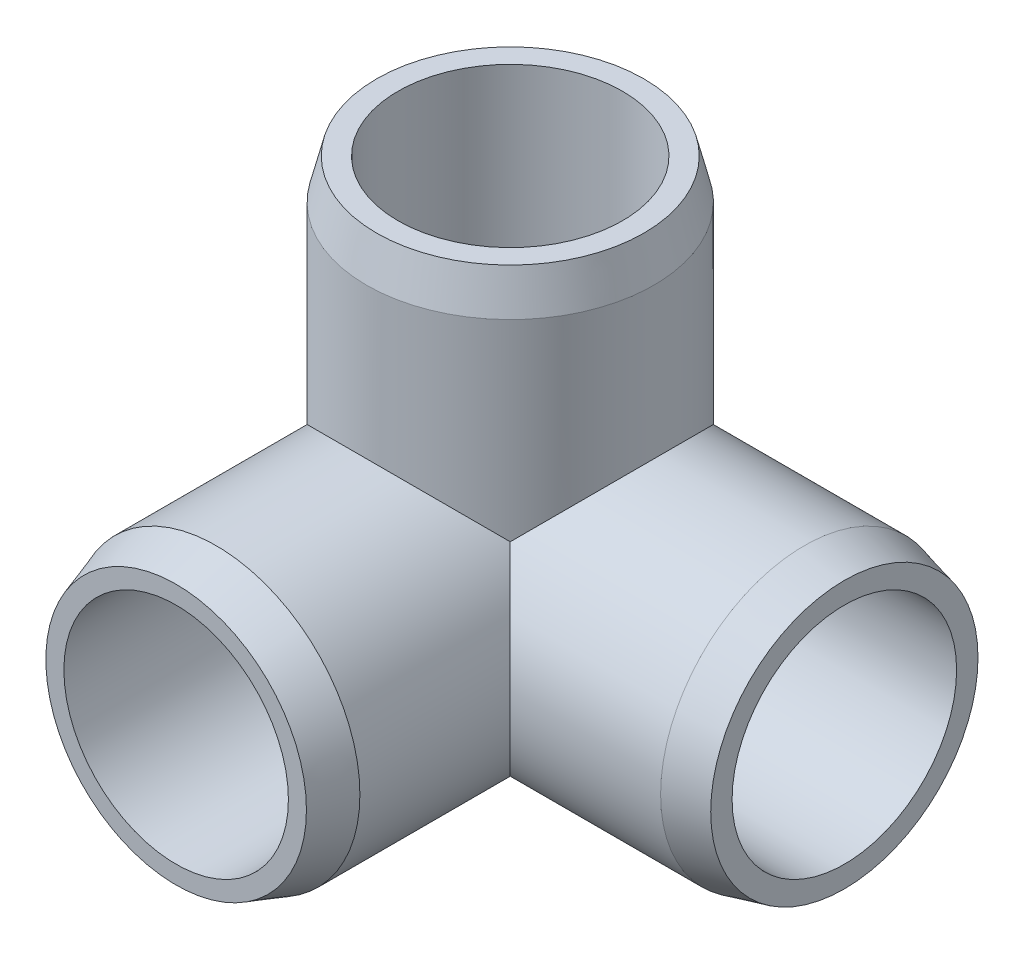
ISO-10303-21;
HEADER;
FILE_DESCRIPTION(('STEP AP214'),'2;1');
FILE_NAME('part.step','',(''),(''),'','','');
FILE_SCHEMA(('AUTOMOTIVE_DESIGN { 1 0 10303 214 1 1 1 1 }'));
ENDSEC;
DATA;
#1=APPLICATION_CONTEXT('core data for automotive mechanical design processes');
#2=APPLICATION_PROTOCOL_DEFINITION('international standard','automotive_design',2000,#1);
#3=PRODUCT_CONTEXT('',#1,'mechanical');
#4=PRODUCT('Part','Part','',(#3));
#5=PRODUCT_RELATED_PRODUCT_CATEGORY('part','',(#4));
#6=PRODUCT_DEFINITION_FORMATION('','',#4);
#7=PRODUCT_DEFINITION_CONTEXT('part definition',#1,'design');
#8=PRODUCT_DEFINITION('design','',#6,#7);
#9=PRODUCT_DEFINITION_SHAPE('','',#8);
#10=(LENGTH_UNIT() NAMED_UNIT(*) SI_UNIT(.MILLI.,.METRE.));
#11=(NAMED_UNIT(*) PLANE_ANGLE_UNIT() SI_UNIT($,.RADIAN.));
#12=(NAMED_UNIT(*) SI_UNIT($,.STERADIAN.) SOLID_ANGLE_UNIT());
#13=UNCERTAINTY_MEASURE_WITH_UNIT(LENGTH_MEASURE(1.E-05),#10,'distance_accuracy_value','');
#14=(GEOMETRIC_REPRESENTATION_CONTEXT(3) GLOBAL_UNCERTAINTY_ASSIGNED_CONTEXT((#13)) GLOBAL_UNIT_ASSIGNED_CONTEXT((#10,
#11,#12)) REPRESENTATION_CONTEXT('',''));
#15=CARTESIAN_POINT('',(0.,0.,0.));
#16=DIRECTION('',(0.,0.,1.));
#17=DIRECTION('',(1.,0.,0.));
#18=AXIS2_PLACEMENT_3D('',#15,#16,#17);
#19=CARTESIAN_POINT('',(31.75,13.6525,0.));
#20=DIRECTION('',(1.,0.,0.));
#21=DIRECTION('',(0.,0.,-1.));
#22=AXIS2_PLACEMENT_3D('',#19,#20,#21);
#23=PLANE('',#22);
#24=CARTESIAN_POINT('',(31.75,13.6525,0.));
#25=DIRECTION('',(1.,0.,0.));
#26=DIRECTION('',(0.,0.,-1.));
#27=AXIS2_PLACEMENT_3D('',#24,#25,#26);
#28=CIRCLE('',#27,10.6679999999998);
#29=CARTESIAN_POINT('',(31.75,13.6525,-10.6679999999999));
#30=VERTEX_POINT('',#29);
#31=EDGE_CURVE('E116',#30,#30,#28,.T.);
#32=ORIENTED_EDGE('',*,*,#31,.F.);
#33=EDGE_LOOP('',(#32));
#34=FACE_BOUND('',#33,.T.);
#35=CARTESIAN_POINT('',(31.75,13.6525,0.));
#36=DIRECTION('',(1.,0.,0.));
#37=DIRECTION('',(0.,0.,-1.));
#38=AXIS2_PLACEMENT_3D('',#35,#36,#37);
#39=CIRCLE('',#38,12.6999999999998);
#40=CARTESIAN_POINT('',(31.75,13.6525,-12.6999999999998));
#41=VERTEX_POINT('',#40);
#42=EDGE_CURVE('E227',#41,#41,#39,.T.);
#43=ORIENTED_EDGE('',*,*,#42,.T.);
#44=EDGE_LOOP('',(#43));
#45=FACE_BOUND('',#44,.T.);
#46=ADVANCED_FACE('F39',(#34,#45),#23,.T.);
#47=CARTESIAN_POINT('',(-500000.,13.6525,0.));
#48=DIRECTION('',(1.,0.,0.));
#49=DIRECTION('',(0.,0.,-1.));
#50=AXIS2_PLACEMENT_3D('',#47,#48,#49);
#51=CYLINDRICAL_SURFACE('',#50,13.6524999999998);
#52=CARTESIAN_POINT('',(0.,13.6525,0.));
#53=DIRECTION('',(1.,0.,0.));
#54=DIRECTION('',(0.,0.,-1.));
#55=AXIS2_PLACEMENT_3D('',#52,#53,#54);
#56=CIRCLE('',#55,13.6525);
#57=CARTESIAN_POINT('',(0.,13.6525,-13.6525));
#58=VERTEX_POINT('',#57);
#59=CARTESIAN_POINT('',(0.,0.,0.));
#60=VERTEX_POINT('',#59);
#61=EDGE_CURVE('E107',#58,#60,#56,.F.);
#62=ORIENTED_EDGE('',*,*,#61,.F.);
#63=CARTESIAN_POINT('',(0.,13.6525,0.));
#64=DIRECTION('',(0.707106781186547,-0.707106781186547,0.));
#65=DIRECTION('',(0.707106781186547,0.707106781186547,0.));
#66=AXIS2_PLACEMENT_3D('',#63,#64,#65);
#67=ELLIPSE('',#66,19.3075506602986,13.6524999999999);
#68=CARTESIAN_POINT('',(9.65377533014933,23.3062753301493,9.65377533014926));
#69=VERTEX_POINT('',#68);
#70=EDGE_CURVE('E109',#58,#69,#67,.T.);
#71=ORIENTED_EDGE('',*,*,#70,.T.);
#72=CARTESIAN_POINT('',(5.6843418860808E-11,13.6525,0.));
#73=DIRECTION('',(0.707106781186545,0.,-0.70710678118655));
#74=DIRECTION('',(0.70710678118655,0.,0.707106781186545));
#75=AXIS2_PLACEMENT_3D('',#72,#73,#74);
#76=ELLIPSE('',#75,19.3075506602986,13.6524999999999);
#77=EDGE_CURVE('E62',#69,#60,#76,.T.);
#78=ORIENTED_EDGE('',*,*,#77,.T.);
#79=EDGE_LOOP('',(#62,#71,#78));
#80=FACE_BOUND('',#79,.T.);
#81=CARTESIAN_POINT('',(27.94,13.6525,0.));
#82=DIRECTION('',(1.,0.,0.));
#83=DIRECTION('',(0.,0.,-1.));
#84=AXIS2_PLACEMENT_3D('',#81,#82,#83);
#85=CIRCLE('',#84,13.6524999999998);
#86=CARTESIAN_POINT('',(27.94,13.6525,-13.6524999999998));
#87=VERTEX_POINT('',#86);
#88=EDGE_CURVE('E224',#87,#87,#85,.T.);
#89=ORIENTED_EDGE('',*,*,#88,.F.);
#90=EDGE_LOOP('',(#89));
#91=FACE_BOUND('',#90,.T.);
#92=ADVANCED_FACE('F189',(#80,#91),#51,.T.);
#93=CARTESIAN_POINT('',(-500000.,13.6525,0.));
#94=DIRECTION('',(1.,0.,0.));
#95=DIRECTION('',(0.,0.,-1.));
#96=AXIS2_PLACEMENT_3D('',#93,#94,#95);
#97=CYLINDRICAL_SURFACE('',#96,10.6679999999998);
#98=ORIENTED_EDGE('',*,*,#31,.T.);
#99=EDGE_LOOP('',(#98));
#100=FACE_BOUND('',#99,.T.);
#101=CARTESIAN_POINT('',(12.6999999999953,13.6525,0.));
#102=DIRECTION('',(-1.,0.,0.));
#103=DIRECTION('',(0.,0.,1.));
#104=AXIS2_PLACEMENT_3D('',#101,#102,#103);
#105=CIRCLE('',#104,10.6679999999998);
#106=CARTESIAN_POINT('',(12.6999999999953,13.6525,10.6679999999997));
#107=VERTEX_POINT('',#106);
#108=EDGE_CURVE('E12',#107,#107,#105,.F.);
#109=ORIENTED_EDGE('',*,*,#108,.F.);
#110=EDGE_LOOP('',(#109));
#111=FACE_BOUND('',#110,.T.);
#112=ADVANCED_FACE('F181',(#100,#111),#97,.F.);
#113=CARTESIAN_POINT('',(0.25399999999999,13.6525,0.));
#114=DIRECTION('',(1.,0.,0.));
#115=DIRECTION('',(0.,0.,-1.));
#116=AXIS2_PLACEMENT_3D('',#113,#114,#115);
#117=CIRCLE('',#116,10.6679999999998);
#118=CARTESIAN_POINT('',(0.253999999999992,2.98752423818976,0.253999999992599));
#119=VERTEX_POINT('',#118);
#120=CARTESIAN_POINT('',(0.25399999999999,13.9064999999964,-10.6649757618102));
#121=VERTEX_POINT('',#120);
#122=EDGE_CURVE('E91',#119,#121,#117,.T.);
#123=ORIENTED_EDGE('',*,*,#122,.F.);
#124=CARTESIAN_POINT('',(0.,13.6525,0.));
#125=DIRECTION('',(-0.707106781186545,0.,0.70710678118655));
#126=DIRECTION('',(0.70710678118655,0.,0.707106781186545));
#127=AXIS2_PLACEMENT_3D('',#124,#125,#126);
#128=ELLIPSE('',#127,15.0868302833961,10.6679999999999);
#129=CARTESIAN_POINT('',(7.54341514169815,21.195915141698,7.543415141698));
#130=VERTEX_POINT('',#129);
#131=EDGE_CURVE('E93',#119,#130,#128,.T.);
#132=ORIENTED_EDGE('',*,*,#131,.T.);
#133=CARTESIAN_POINT('',(0.,13.6525,0.));
#134=DIRECTION('',(-0.707106781186547,0.707106781186547,0.));
#135=DIRECTION('',(0.707106781186547,0.707106781186547,0.));
#136=AXIS2_PLACEMENT_3D('',#133,#134,#135);
#137=ELLIPSE('',#136,15.0868302833961,10.6679999999999);
#138=EDGE_CURVE('E87',#121,#130,#137,.F.);
#139=ORIENTED_EDGE('',*,*,#138,.F.);
#140=EDGE_LOOP('',(#123,#132,#139));
#141=FACE_BOUND('',#140,.T.);
#142=CARTESIAN_POINT('',(10.7949999999732,13.6525,0.));
#143=DIRECTION('',(1.,0.,0.));
#144=DIRECTION('',(0.,0.,-1.));
#145=AXIS2_PLACEMENT_3D('',#142,#143,#144);
#146=CIRCLE('',#145,10.6679999999998);
#147=CARTESIAN_POINT('',(10.7949999999732,13.6525,-10.6679999999999));
#148=VERTEX_POINT('',#147);
#149=EDGE_CURVE('E47',#148,#148,#146,.F.);
#150=ORIENTED_EDGE('',*,*,#149,.F.);
#151=EDGE_LOOP('',(#150));
#152=FACE_BOUND('',#151,.T.);
#153=ADVANCED_FACE('F89',(#141,#152),#97,.F.);
#154=CARTESIAN_POINT('',(0.,13.6525,0.));
#155=DIRECTION('',(0.,1.,0.));
#156=DIRECTION('',(1.,0.,0.));
#157=AXIS2_PLACEMENT_3D('',#154,#155,#156);
#158=SPHERICAL_SURFACE('',#157,10.668);
#159=CARTESIAN_POINT('',(0.25399999999999,13.6525,0.));
#160=DIRECTION('',(1.,0.,0.));
#161=DIRECTION('',(0.,0.,-1.));
#162=AXIS2_PLACEMENT_3D('',#159,#160,#161);
#163=CIRCLE('',#162,10.6649757618102);
#164=CARTESIAN_POINT('',(0.25399999999999,13.6525,-10.6649757618102));
#165=VERTEX_POINT('',#164);
#166=CARTESIAN_POINT('',(0.254000000000123,2.98752423818976,0.));
#167=VERTEX_POINT('',#166);
#168=EDGE_CURVE('E54',#165,#167,#163,.F.);
#169=ORIENTED_EDGE('',*,*,#168,.F.);
#170=CARTESIAN_POINT('',(0.,13.6525,0.));
#171=DIRECTION('',(0.,1.,0.));
#172=DIRECTION('',(0.,0.,1.));
#173=AXIS2_PLACEMENT_3D('',#170,#171,#172);
#174=CIRCLE('',#173,10.668);
#175=CARTESIAN_POINT('',(-10.668,13.6525,0.));
#176=VERTEX_POINT('',#175);
#177=EDGE_CURVE('E106',#165,#176,#174,.T.);
#178=ORIENTED_EDGE('',*,*,#177,.T.);
#179=CARTESIAN_POINT('',(0.,13.6525,0.));
#180=DIRECTION('',(0.,0.,1.));
#181=DIRECTION('',(1.,0.,0.));
#182=AXIS2_PLACEMENT_3D('',#179,#180,#181);
#183=CIRCLE('',#182,10.668);
#184=EDGE_CURVE('E149',#176,#167,#183,.T.);
#185=ORIENTED_EDGE('',*,*,#184,.T.);
#186=EDGE_LOOP('',(#169,#178,#185));
#187=FACE_BOUND('',#186,.T.);
#188=ADVANCED_FACE('F180',(#187),#158,.F.);
#189=CARTESIAN_POINT('',(0.,13.6525,0.));
#190=DIRECTION('',(0.,1.,0.));
#191=DIRECTION('',(1.,0.,0.));
#192=AXIS2_PLACEMENT_3D('',#189,#190,#191);
#193=SPHERICAL_SURFACE('',#192,13.6525);
#194=ORIENTED_EDGE('',*,*,#61,.T.);
#195=CARTESIAN_POINT('',(0.,13.6525,0.));
#196=DIRECTION('',(0.,0.,1.));
#197=DIRECTION('',(1.,0.,0.));
#198=AXIS2_PLACEMENT_3D('',#195,#196,#197);
#199=CIRCLE('',#198,13.6525);
#200=CARTESIAN_POINT('',(-13.6525,13.6525,0.));
#201=VERTEX_POINT('',#200);
#202=EDGE_CURVE('E157',#201,#60,#199,.T.);
#203=ORIENTED_EDGE('',*,*,#202,.F.);
#204=CARTESIAN_POINT('',(0.,13.6525,0.));
#205=DIRECTION('',(0.,1.,0.));
#206=DIRECTION('',(0.,0.,1.));
#207=AXIS2_PLACEMENT_3D('',#204,#205,#206);
#208=CIRCLE('',#207,13.6525);
#209=EDGE_CURVE('E165',#58,#201,#208,.T.);
#210=ORIENTED_EDGE('',*,*,#209,.F.);
#211=EDGE_LOOP('',(#194,#203,#210));
#212=FACE_BOUND('',#211,.T.);
#213=ADVANCED_FACE('F41',(#212),#193,.T.);
#214=CARTESIAN_POINT('',(0.,13.6525,-13.6535000000001));
#215=DIRECTION('',(0.,0.,1.));
#216=DIRECTION('',(1.,0.,0.));
#217=AXIS2_PLACEMENT_3D('',#214,#215,#216);
#218=CYLINDRICAL_SURFACE('',#217,13.6525);
#219=ORIENTED_EDGE('',*,*,#202,.T.);
#220=ORIENTED_EDGE('',*,*,#77,.F.);
#221=CARTESIAN_POINT('',(0.,13.6525,0.));
#222=DIRECTION('',(0.,0.707106781186548,-0.707106781186547));
#223=DIRECTION('',(0.,0.707106781186548,0.707106781186547));
#224=AXIS2_PLACEMENT_3D('',#221,#222,#223);
#225=ELLIPSE('',#224,19.3075506602987,13.6525);
#226=EDGE_CURVE('E159',#69,#201,#225,.F.);
#227=ORIENTED_EDGE('',*,*,#226,.T.);
#228=EDGE_LOOP('',(#219,#220,#227));
#229=FACE_BOUND('',#228,.T.);
#230=CARTESIAN_POINT('',(1.56818475708975E-13,13.6525,27.9399999999999));
#231=DIRECTION('',(0.,0.,1.));
#232=DIRECTION('',(1.,0.,0.));
#233=AXIS2_PLACEMENT_3D('',#230,#231,#232);
#234=CIRCLE('',#233,13.6525000000002);
#235=CARTESIAN_POINT('',(13.6525000000003,13.6525,27.9399999999996));
#236=VERTEX_POINT('',#235);
#237=EDGE_CURVE('E118',#236,#236,#234,.T.);
#238=ORIENTED_EDGE('',*,*,#237,.F.);
#239=EDGE_LOOP('',(#238));
#240=FACE_BOUND('',#239,.T.);
#241=ADVANCED_FACE('F377',(#229,#240),#218,.T.);
#242=CARTESIAN_POINT('',(2.21709065016539E-13,13.6525,31.75));
#243=DIRECTION('',(0.,0.,-1.));
#244=DIRECTION('',(-1.,0.,0.));
#245=AXIS2_PLACEMENT_3D('',#242,#243,#244);
#246=PLANE('',#245);
#247=CARTESIAN_POINT('',(2.21709065016539E-13,13.6525,31.75));
#248=DIRECTION('',(0.,0.,-1.));
#249=DIRECTION('',(-1.,0.,0.));
#250=AXIS2_PLACEMENT_3D('',#247,#248,#249);
#251=CIRCLE('',#250,10.668);
#252=CARTESIAN_POINT('',(10.6680000000002,13.6525,31.7499999999999));
#253=VERTEX_POINT('',#252);
#254=EDGE_CURVE('E154',#253,#253,#251,.T.);
#255=ORIENTED_EDGE('',*,*,#254,.T.);
#256=EDGE_LOOP('',(#255));
#257=FACE_BOUND('',#256,.T.);
#258=CARTESIAN_POINT('',(2.22044604925029E-13,13.6525,31.7499999999999));
#259=DIRECTION('',(0.,0.,1.));
#260=DIRECTION('',(1.,0.,0.));
#261=AXIS2_PLACEMENT_3D('',#258,#259,#260);
#262=CIRCLE('',#261,12.3825);
#263=CARTESIAN_POINT('',(12.3825000000002,13.6525,31.7499999999997));
#264=VERTEX_POINT('',#263);
#265=EDGE_CURVE('E122',#264,#264,#262,.T.);
#266=ORIENTED_EDGE('',*,*,#265,.T.);
#267=EDGE_LOOP('',(#266));
#268=FACE_BOUND('',#267,.T.);
#269=ADVANCED_FACE('F370',(#257,#268),#246,.F.);
#270=CARTESIAN_POINT('',(0.,50.4548533329512,0.));
#271=DIRECTION('',(0.,1.,0.));
#272=DIRECTION('',(0.,0.,1.));
#273=AXIS2_PLACEMENT_3D('',#270,#271,#272);
#274=CYLINDRICAL_SURFACE('',#273,13.6525);
#275=ORIENTED_EDGE('',*,*,#226,.F.);
#276=ORIENTED_EDGE('',*,*,#70,.F.);
#277=ORIENTED_EDGE('',*,*,#209,.T.);
#278=EDGE_LOOP('',(#275,#276,#277));
#279=FACE_BOUND('',#278,.T.);
#280=CARTESIAN_POINT('',(0.,41.5925,0.));
#281=DIRECTION('',(0.,1.,0.));
#282=DIRECTION('',(0.,0.,1.));
#283=AXIS2_PLACEMENT_3D('',#280,#281,#282);
#284=CIRCLE('',#283,13.6525);
#285=CARTESIAN_POINT('',(0.,41.5925,13.6525));
#286=VERTEX_POINT('',#285);
#287=EDGE_CURVE('E125',#286,#286,#284,.T.);
#288=ORIENTED_EDGE('',*,*,#287,.F.);
#289=EDGE_LOOP('',(#288));
#290=FACE_BOUND('',#289,.T.);
#291=ADVANCED_FACE('F362',(#279,#290),#274,.T.);
#292=CARTESIAN_POINT('',(13.6525,45.4025,0.));
#293=DIRECTION('',(0.,-1.,0.));
#294=DIRECTION('',(0.,0.,-1.));
#295=AXIS2_PLACEMENT_3D('',#292,#293,#294);
#296=PLANE('',#295);
#297=CARTESIAN_POINT('',(0.,45.4025,0.));
#298=DIRECTION('',(0.,1.,0.));
#299=DIRECTION('',(0.,0.,1.));
#300=AXIS2_PLACEMENT_3D('',#297,#298,#299);
#301=CIRCLE('',#300,10.668);
#302=CARTESIAN_POINT('',(0.,45.4025,10.668));
#303=VERTEX_POINT('',#302);
#304=EDGE_CURVE('E162',#303,#303,#301,.T.);
#305=ORIENTED_EDGE('',*,*,#304,.F.);
#306=EDGE_LOOP('',(#305));
#307=FACE_BOUND('',#306,.T.);
#308=CARTESIAN_POINT('',(0.,45.4025,0.));
#309=DIRECTION('',(0.,1.,0.));
#310=DIRECTION('',(0.,0.,1.));
#311=AXIS2_PLACEMENT_3D('',#308,#309,#310);
#312=CIRCLE('',#311,12.7);
#313=CARTESIAN_POINT('',(0.,45.4025,12.7));
#314=VERTEX_POINT('',#313);
#315=EDGE_CURVE('E128',#314,#314,#312,.T.);
#316=ORIENTED_EDGE('',*,*,#315,.T.);
#317=EDGE_LOOP('',(#316));
#318=FACE_BOUND('',#317,.T.);
#319=ADVANCED_FACE('F356',(#307,#318),#296,.F.);
#320=CARTESIAN_POINT('',(0.,13.6525,-13.6535000000001));
#321=DIRECTION('',(0.,0.,1.));
#322=DIRECTION('',(1.,0.,0.));
#323=AXIS2_PLACEMENT_3D('',#320,#321,#322);
#324=CYLINDRICAL_SURFACE('',#323,10.668);
#325=CARTESIAN_POINT('',(0.,13.6525,12.7));
#326=DIRECTION('',(0.,0.,1.));
#327=DIRECTION('',(1.,0.,0.));
#328=AXIS2_PLACEMENT_3D('',#325,#326,#327);
#329=CIRCLE('',#328,10.668);
#330=CARTESIAN_POINT('',(10.6680000000001,13.6525,12.7));
#331=VERTEX_POINT('',#330);
#332=EDGE_CURVE('E171',#331,#331,#329,.T.);
#333=CARTESIAN_POINT('',(10.6680000000001,13.6525,12.7));
#334=CARTESIAN_POINT('',(10.6680000000001,13.6525,12.8984375));
#335=CARTESIAN_POINT('',(10.6680000000001,13.6525,13.096875));
#336=CARTESIAN_POINT('',(10.6680000000001,13.6525,13.49375));
#337=CARTESIAN_POINT('',(10.6680000000001,13.6525,13.6921875));
#338=CARTESIAN_POINT('',(10.6680000000001,13.6525,14.0890625));
#339=CARTESIAN_POINT('',(10.6680000000001,13.6525,14.2875));
#340=CARTESIAN_POINT('',(10.6680000000001,13.6525,14.684375));
#341=CARTESIAN_POINT('',(10.6680000000001,13.6525,14.8828125));
#342=CARTESIAN_POINT('',(10.6680000000001,13.6525,15.2796875));
#343=CARTESIAN_POINT('',(10.6680000000001,13.6525,15.478125));
#344=CARTESIAN_POINT('',(10.6680000000001,13.6525,15.875));
#345=CARTESIAN_POINT('',(10.6680000000001,13.6525,16.0734375));
#346=CARTESIAN_POINT('',(10.6680000000001,13.6525,16.4703125));
#347=CARTESIAN_POINT('',(10.6680000000001,13.6525,16.66875));
#348=CARTESIAN_POINT('',(10.6680000000001,13.6525,17.065625));
#349=CARTESIAN_POINT('',(10.6680000000001,13.6525,17.2640625));
#350=CARTESIAN_POINT('',(10.6680000000001,13.6525,17.6609375));
#351=CARTESIAN_POINT('',(10.6680000000001,13.6525,17.859375));
#352=CARTESIAN_POINT('',(10.6680000000001,13.6525,18.25625));
#353=CARTESIAN_POINT('',(10.6680000000001,13.6525,18.4546875));
#354=CARTESIAN_POINT('',(10.6680000000001,13.6525,18.8515625));
#355=CARTESIAN_POINT('',(10.6680000000001,13.6525,19.05));
#356=CARTESIAN_POINT('',(10.6680000000001,13.6525,19.446875));
#357=CARTESIAN_POINT('',(10.6680000000001,13.6525,19.6453125));
#358=CARTESIAN_POINT('',(10.6680000000001,13.6525,20.0421875));
#359=CARTESIAN_POINT('',(10.6680000000001,13.6525,20.240625));
#360=CARTESIAN_POINT('',(10.6680000000001,13.6525,20.6375));
#361=CARTESIAN_POINT('',(10.6680000000001,13.6525,20.8359375));
#362=CARTESIAN_POINT('',(10.6680000000001,13.6525,21.2328125));
#363=CARTESIAN_POINT('',(10.6680000000001,13.6525,21.43125));
#364=CARTESIAN_POINT('',(10.6680000000002,13.6525,21.828125));
#365=CARTESIAN_POINT('',(10.6680000000002,13.6525,22.0265625));
#366=CARTESIAN_POINT('',(10.6680000000002,13.6525,22.4234375));
#367=CARTESIAN_POINT('',(10.6680000000002,13.6525,22.621875));
#368=CARTESIAN_POINT('',(10.6680000000002,13.6525,23.01875));
#369=CARTESIAN_POINT('',(10.6680000000002,13.6525,23.2171875));
#370=CARTESIAN_POINT('',(10.6680000000002,13.6525,23.6140625));
#371=CARTESIAN_POINT('',(10.6680000000002,13.6525,23.8125));
#372=CARTESIAN_POINT('',(10.6680000000002,13.6525,24.209375));
#373=CARTESIAN_POINT('',(10.6680000000002,13.6525,24.4078125));
#374=CARTESIAN_POINT('',(10.6680000000002,13.6525,24.8046875));
#375=CARTESIAN_POINT('',(10.6680000000002,13.6525,25.003125));
#376=CARTESIAN_POINT('',(10.6680000000002,13.6525,25.4));
#377=CARTESIAN_POINT('',(10.6680000000002,13.6525,25.5984375));
#378=CARTESIAN_POINT('',(10.6680000000002,13.6525,25.9953125));
#379=CARTESIAN_POINT('',(10.6680000000002,13.6525,26.1937499999999));
#380=CARTESIAN_POINT('',(10.6680000000002,13.6525,26.5906249999999));
#381=CARTESIAN_POINT('',(10.6680000000002,13.6525,26.7890625));
#382=CARTESIAN_POINT('',(10.6680000000002,13.6525,27.1859374999999));
#383=CARTESIAN_POINT('',(10.6680000000002,13.6525,27.3843749999999));
#384=CARTESIAN_POINT('',(10.6680000000002,13.6525,27.7812499999999));
#385=CARTESIAN_POINT('',(10.6680000000002,13.6525,27.9796874999999));
#386=CARTESIAN_POINT('',(10.6680000000002,13.6525,28.3765624999999));
#387=CARTESIAN_POINT('',(10.6680000000002,13.6525,28.5749999999999));
#388=CARTESIAN_POINT('',(10.6680000000002,13.6525,28.9718749999999));
#389=CARTESIAN_POINT('',(10.6680000000002,13.6525,29.1703124999999));
#390=CARTESIAN_POINT('',(10.6680000000002,13.6525,29.5671874999999));
#391=CARTESIAN_POINT('',(10.6680000000002,13.6525,29.7656249999999));
#392=CARTESIAN_POINT('',(10.6680000000002,13.6525,30.1624999999999));
#393=CARTESIAN_POINT('',(10.6680000000002,13.6525,30.3609374999999));
#394=CARTESIAN_POINT('',(10.6680000000002,13.6525,30.7578124999999));
#395=CARTESIAN_POINT('',(10.6680000000002,13.6525,30.9562499999999));
#396=CARTESIAN_POINT('',(10.6680000000002,13.6525,31.3531249999999));
#397=CARTESIAN_POINT('',(10.6680000000002,13.6525,31.5515624999999));
#398=CARTESIAN_POINT('',(10.6680000000002,13.6525,31.7499999999999));
#399=B_SPLINE_CURVE_WITH_KNOTS('',3,(#333,#334,#335,#336,#337,#338,#339,#340,#341,#342,#343,
#344,#345,#346,#347,#348,#349,#350,#351,#352,#353,#354,#355,#356,#357,#358,#359,#360,#361,#362,
#363,#364,#365,#366,#367,#368,#369,#370,#371,#372,#373,#374,#375,#376,#377,#378,#379,#380,#381,
#382,#383,#384,#385,#386,#387,#388,#389,#390,#391,#392,#393,#394,#395,#396,#397,#398),
.UNSPECIFIED.,.F.,.F.,(4,2,2,2,2,2,2,2,2,2,2,2,2,2,2,2,2,2,2,2,2,2,2,2,2,2,2,2,2,2,2,2,4),(0.,
0.595312499999997,1.190625,1.78593749999999,2.38124999999999,2.97656249999999,3.57187499999999,
4.16718749999998,4.76249999999998,5.35781249999998,5.95312499999998,6.54843749999997,
7.14374999999997,7.73906249999996,8.33437499999997,8.92968749999997,9.52499999999997,10.1203125,
10.715625,11.3109375,11.90625,12.5015625,13.096875,13.6921874999999,14.2874999999999,
14.8828124999999,15.4781249999999,16.0734374999999,16.6687499999999,17.2640624999999,
17.8593749999999,18.4546874999999,19.0499999999999),.UNSPECIFIED.);
#400=EDGE_CURVE('BSEAM337',#331,#253,#399,.T.);
#401=ORIENTED_EDGE('',*,*,#332,.F.);
#402=ORIENTED_EDGE('',*,*,#254,.F.);
#403=ORIENTED_EDGE('',*,*,#400,.T.);
#404=ORIENTED_EDGE('',*,*,#400,.F.);
#405=EDGE_LOOP('',(#401,#403,#402,#404));
#406=FACE_BOUND('',#405,.T.);
#407=ADVANCED_FACE('F337',(#406),#324,.F.);
#408=CARTESIAN_POINT('',(0.,50.4548533329512,0.));
#409=DIRECTION('',(0.,1.,0.));
#410=DIRECTION('',(0.,0.,1.));
#411=AXIS2_PLACEMENT_3D('',#408,#409,#410);
#412=CYLINDRICAL_SURFACE('',#411,10.668);
#413=CARTESIAN_POINT('',(0.,26.3525,0.));
#414=DIRECTION('',(0.,1.,0.));
#415=DIRECTION('',(0.,0.,1.));
#416=AXIS2_PLACEMENT_3D('',#413,#414,#415);
#417=CIRCLE('',#416,10.668);
#418=CARTESIAN_POINT('',(0.,26.3525,10.668));
#419=VERTEX_POINT('',#418);
#420=EDGE_CURVE('E146',#419,#419,#417,.T.);
#421=ORIENTED_EDGE('',*,*,#420,.F.);
#422=EDGE_LOOP('',(#421));
#423=FACE_BOUND('',#422,.T.);
#424=ORIENTED_EDGE('',*,*,#304,.T.);
#425=EDGE_LOOP('',(#424));
#426=FACE_BOUND('',#425,.T.);
#427=ADVANCED_FACE('F343',(#423,#426),#412,.F.);
#428=CARTESIAN_POINT('',(0.,24.4475,0.));
#429=DIRECTION('',(0.,1.,0.));
#430=DIRECTION('',(0.,0.,1.));
#431=AXIS2_PLACEMENT_3D('',#428,#429,#430);
#432=CIRCLE('',#431,10.668);
#433=CARTESIAN_POINT('',(0.,24.4475,10.668));
#434=VERTEX_POINT('',#433);
#435=EDGE_CURVE('E137',#434,#434,#432,.T.);
#436=ORIENTED_EDGE('',*,*,#435,.T.);
#437=EDGE_LOOP('',(#436));
#438=FACE_BOUND('',#437,.T.);
#439=DIRECTION('',(0.,1.,0.));
#440=VECTOR('',#439,1.);
#441=CARTESIAN_POINT('',(0.25399999999999,50.4548533329512,-10.6649757618102));
#442=LINE('',#441,#440);
#443=EDGE_CURVE('E100',#121,#165,#442,.F.);
#444=ORIENTED_EDGE('',*,*,#443,.F.);
#445=ORIENTED_EDGE('',*,*,#138,.T.);
#446=CARTESIAN_POINT('',(0.,13.6525,0.));
#447=DIRECTION('',(0.,0.707106781186547,-0.707106781186547));
#448=DIRECTION('',(0.,0.707106781186547,0.707106781186547));
#449=AXIS2_PLACEMENT_3D('',#446,#447,#448);
#450=ELLIPSE('',#449,15.0868302833962,10.668);
#451=EDGE_CURVE('E152',#176,#130,#450,.T.);
#452=ORIENTED_EDGE('',*,*,#451,.F.);
#453=ORIENTED_EDGE('',*,*,#177,.F.);
#454=EDGE_LOOP('',(#444,#445,#452,#453));
#455=FACE_BOUND('',#454,.T.);
#456=ADVANCED_FACE('F105',(#438,#455),#412,.F.);
#457=ORIENTED_EDGE('',*,*,#131,.F.);
#458=DIRECTION('',(0.,0.,1.));
#459=VECTOR('',#458,1.);
#460=CARTESIAN_POINT('',(0.25399999999999,2.98752423818976,-13.6535000000001));
#461=LINE('',#460,#459);
#462=EDGE_CURVE('E101',#119,#167,#461,.F.);
#463=ORIENTED_EDGE('',*,*,#462,.T.);
#464=ORIENTED_EDGE('',*,*,#184,.F.);
#465=ORIENTED_EDGE('',*,*,#451,.T.);
#466=EDGE_LOOP('',(#457,#463,#464,#465));
#467=FACE_BOUND('',#466,.T.);
#468=CARTESIAN_POINT('',(0.,13.6525,10.795));
#469=DIRECTION('',(0.,0.,-1.));
#470=DIRECTION('',(-1.,0.,0.));
#471=AXIS2_PLACEMENT_3D('',#468,#469,#470);
#472=CIRCLE('',#471,10.668);
#473=CARTESIAN_POINT('',(-10.6679999999999,13.6525,10.795));
#474=VERTEX_POINT('',#473);
#475=EDGE_CURVE('E168',#474,#474,#472,.T.);
#476=ORIENTED_EDGE('',*,*,#475,.F.);
#477=EDGE_LOOP('',(#476));
#478=FACE_BOUND('',#477,.T.);
#479=ADVANCED_FACE('F327',(#467,#478),#324,.F.);
#480=CARTESIAN_POINT('',(-10.668,26.3525,0.));
#481=DIRECTION('',(0.,1.,0.));
#482=DIRECTION('',(0.,0.,1.));
#483=AXIS2_PLACEMENT_3D('',#480,#481,#482);
#484=PLANE('',#483);
#485=ORIENTED_EDGE('',*,*,#420,.T.);
#486=EDGE_LOOP('',(#485));
#487=FACE_BOUND('',#486,.T.);
#488=CARTESIAN_POINT('',(0.,26.3525,0.));
#489=DIRECTION('',(0.,1.,0.));
#490=DIRECTION('',(0.,0.,1.));
#491=AXIS2_PLACEMENT_3D('',#488,#489,#490);
#492=CIRCLE('',#491,9.398);
#493=CARTESIAN_POINT('',(0.,26.3525,9.398));
#494=VERTEX_POINT('',#493);
#495=EDGE_CURVE('E143',#494,#494,#492,.T.);
#496=ORIENTED_EDGE('',*,*,#495,.F.);
#497=EDGE_LOOP('',(#496));
#498=FACE_BOUND('',#497,.T.);
#499=ADVANCED_FACE('F319',(#487,#498),#484,.T.);
#500=CARTESIAN_POINT('',(0.,45.4025,0.));
#501=DIRECTION('',(0.,1.,0.));
#502=DIRECTION('',(0.,0.,1.));
#503=AXIS2_PLACEMENT_3D('',#500,#501,#502);
#504=CYLINDRICAL_SURFACE('',#503,9.398);
#505=ORIENTED_EDGE('',*,*,#495,.T.);
#506=EDGE_LOOP('',(#505));
#507=FACE_BOUND('',#506,.T.);
#508=CARTESIAN_POINT('',(0.,24.4475,0.));
#509=DIRECTION('',(0.,1.,0.));
#510=DIRECTION('',(0.,0.,1.));
#511=AXIS2_PLACEMENT_3D('',#508,#509,#510);
#512=CIRCLE('',#511,9.398);
#513=CARTESIAN_POINT('',(0.,24.4475,9.398));
#514=VERTEX_POINT('',#513);
#515=EDGE_CURVE('E140',#514,#514,#512,.T.);
#516=ORIENTED_EDGE('',*,*,#515,.F.);
#517=EDGE_LOOP('',(#516));
#518=FACE_BOUND('',#517,.T.);
#519=ADVANCED_FACE('F311',(#507,#518),#504,.F.);
#520=CARTESIAN_POINT('',(-9.398,24.4475,0.));
#521=DIRECTION('',(0.,-1.,0.));
#522=DIRECTION('',(0.,0.,-1.));
#523=AXIS2_PLACEMENT_3D('',#520,#521,#522);
#524=PLANE('',#523);
#525=ORIENTED_EDGE('',*,*,#515,.T.);
#526=EDGE_LOOP('',(#525));
#527=FACE_BOUND('',#526,.T.);
#528=ORIENTED_EDGE('',*,*,#435,.F.);
#529=EDGE_LOOP('',(#528));
#530=FACE_BOUND('',#529,.T.);
#531=ADVANCED_FACE('F302',(#527,#530),#524,.T.);
#532=CARTESIAN_POINT('',(0.,2.9845,12.7));
#533=DIRECTION('',(0.,0.,1.));
#534=DIRECTION('',(1.,0.,0.));
#535=AXIS2_PLACEMENT_3D('',#532,#533,#534);
#536=PLANE('',#535);
#537=ORIENTED_EDGE('',*,*,#332,.T.);
#538=EDGE_LOOP('',(#537));
#539=FACE_BOUND('',#538,.T.);
#540=CARTESIAN_POINT('',(0.,13.6525,12.7));
#541=DIRECTION('',(0.,0.,1.));
#542=DIRECTION('',(1.,0.,0.));
#543=AXIS2_PLACEMENT_3D('',#540,#541,#542);
#544=CIRCLE('',#543,9.398);
#545=CARTESIAN_POINT('',(9.398,13.6525,12.7));
#546=VERTEX_POINT('',#545);
#547=EDGE_CURVE('E134',#546,#546,#544,.T.);
#548=ORIENTED_EDGE('',*,*,#547,.F.);
#549=EDGE_LOOP('',(#548));
#550=FACE_BOUND('',#549,.T.);
#551=ADVANCED_FACE('F294',(#539,#550),#536,.T.);
#552=CARTESIAN_POINT('',(0.,13.6525,31.75));
#553=DIRECTION('',(0.,0.,1.));
#554=DIRECTION('',(1.,0.,0.));
#555=AXIS2_PLACEMENT_3D('',#552,#553,#554);
#556=CYLINDRICAL_SURFACE('',#555,9.398);
#557=ORIENTED_EDGE('',*,*,#547,.T.);
#558=EDGE_LOOP('',(#557));
#559=FACE_BOUND('',#558,.T.);
#560=CARTESIAN_POINT('',(0.,13.6525,10.795));
#561=DIRECTION('',(0.,0.,1.));
#562=DIRECTION('',(1.,0.,0.));
#563=AXIS2_PLACEMENT_3D('',#560,#561,#562);
#564=CIRCLE('',#563,9.398);
#565=CARTESIAN_POINT('',(9.398,13.6525,10.795));
#566=VERTEX_POINT('',#565);
#567=EDGE_CURVE('E131',#566,#566,#564,.T.);
#568=ORIENTED_EDGE('',*,*,#567,.F.);
#569=EDGE_LOOP('',(#568));
#570=FACE_BOUND('',#569,.T.);
#571=ADVANCED_FACE('F286',(#559,#570),#556,.F.);
#572=CARTESIAN_POINT('',(0.,4.2545,10.795));
#573=DIRECTION('',(0.,0.,-1.));
#574=DIRECTION('',(-1.,0.,0.));
#575=AXIS2_PLACEMENT_3D('',#572,#573,#574);
#576=PLANE('',#575);
#577=ORIENTED_EDGE('',*,*,#567,.T.);
#578=EDGE_LOOP('',(#577));
#579=FACE_BOUND('',#578,.T.);
#580=ORIENTED_EDGE('',*,*,#475,.T.);
#581=EDGE_LOOP('',(#580));
#582=FACE_BOUND('',#581,.T.);
#583=ADVANCED_FACE('F277',(#579,#582),#576,.T.);
#584=CARTESIAN_POINT('',(0.,45.4025,0.));
#585=DIRECTION('',(0.,-1.,0.));
#586=DIRECTION('',(0.,0.,-1.));
#587=AXIS2_PLACEMENT_3D('',#584,#585,#586);
#588=CONICAL_SURFACE('',#587,12.7,0.244978663126865);
#589=ORIENTED_EDGE('',*,*,#287,.T.);
#590=EDGE_LOOP('',(#589));
#591=FACE_BOUND('',#590,.T.);
#592=ORIENTED_EDGE('',*,*,#315,.F.);
#593=EDGE_LOOP('',(#592));
#594=FACE_BOUND('',#593,.T.);
#595=ADVANCED_FACE('F268',(#591,#594),#588,.T.);
#596=CARTESIAN_POINT('',(2.22044604925029E-13,13.6525,31.7499999999999));
#597=DIRECTION('',(0.,0.,-1.));
#598=DIRECTION('',(-1.,0.,0.));
#599=AXIS2_PLACEMENT_3D('',#596,#597,#598);
#600=CONICAL_SURFACE('',#599,12.3825,0.321750554396678);
#601=ORIENTED_EDGE('',*,*,#237,.T.);
#602=EDGE_LOOP('',(#601));
#603=FACE_BOUND('',#602,.T.);
#604=ORIENTED_EDGE('',*,*,#265,.F.);
#605=EDGE_LOOP('',(#604));
#606=FACE_BOUND('',#605,.T.);
#607=ADVANCED_FACE('F206',(#603,#606),#600,.T.);
#608=CARTESIAN_POINT('',(0.25399999999999,13.6525,0.));
#609=DIRECTION('',(1.,0.,0.));
#610=DIRECTION('',(0.,0.,-1.));
#611=AXIS2_PLACEMENT_3D('',#608,#609,#610);
#612=PLANE('',#611);
#613=ORIENTED_EDGE('',*,*,#443,.T.);
#614=ORIENTED_EDGE('',*,*,#168,.T.);
#615=ORIENTED_EDGE('',*,*,#462,.F.);
#616=ORIENTED_EDGE('',*,*,#122,.T.);
#617=EDGE_LOOP('',(#613,#614,#615,#616));
#618=FACE_BOUND('',#617,.T.);
#619=ADVANCED_FACE('F99',(#618),#612,.T.);
#620=CARTESIAN_POINT('',(12.7,4.25450000000018,0.));
#621=DIRECTION('',(-1.,0.,0.));
#622=DIRECTION('',(0.,0.,1.));
#623=AXIS2_PLACEMENT_3D('',#620,#621,#622);
#624=PLANE('',#623);
#625=CARTESIAN_POINT('',(12.7,13.6525,0.));
#626=DIRECTION('',(1.,0.,0.));
#627=DIRECTION('',(0.,0.,-1.));
#628=AXIS2_PLACEMENT_3D('',#625,#626,#627);
#629=CIRCLE('',#628,9.39799999999982);
#630=CARTESIAN_POINT('',(12.7,13.6525,-9.39799999999982));
#631=VERTEX_POINT('',#630);
#632=EDGE_CURVE('E228',#631,#631,#629,.T.);
#633=ORIENTED_EDGE('',*,*,#632,.F.);
#634=EDGE_LOOP('',(#633));
#635=FACE_BOUND('',#634,.T.);
#636=ORIENTED_EDGE('',*,*,#108,.T.);
#637=EDGE_LOOP('',(#636));
#638=FACE_BOUND('',#637,.T.);
#639=ADVANCED_FACE('F205',(#635,#638),#624,.F.);
#640=CARTESIAN_POINT('',(10.795,2.98450000000018,0.));
#641=DIRECTION('',(1.,0.,0.));
#642=DIRECTION('',(0.,0.,-1.));
#643=AXIS2_PLACEMENT_3D('',#640,#641,#642);
#644=PLANE('',#643);
#645=ORIENTED_EDGE('',*,*,#149,.T.);
#646=EDGE_LOOP('',(#645));
#647=FACE_BOUND('',#646,.T.);
#648=CARTESIAN_POINT('',(10.795,13.6525,0.));
#649=DIRECTION('',(1.,0.,0.));
#650=DIRECTION('',(0.,0.,-1.));
#651=AXIS2_PLACEMENT_3D('',#648,#649,#650);
#652=CIRCLE('',#651,9.39799999999982);
#653=CARTESIAN_POINT('',(10.795,13.6525,-9.39799999999982));
#654=VERTEX_POINT('',#653);
#655=EDGE_CURVE('E102',#654,#654,#652,.T.);
#656=ORIENTED_EDGE('',*,*,#655,.T.);
#657=EDGE_LOOP('',(#656));
#658=FACE_BOUND('',#657,.T.);
#659=ADVANCED_FACE('F177',(#647,#658),#644,.F.);
#660=CARTESIAN_POINT('',(31.75,13.6525,0.));
#661=DIRECTION('',(1.,0.,0.));
#662=DIRECTION('',(0.,0.,-1.));
#663=AXIS2_PLACEMENT_3D('',#660,#661,#662);
#664=CYLINDRICAL_SURFACE('',#663,9.39799999999982);
#665=ORIENTED_EDGE('',*,*,#655,.F.);
#666=EDGE_LOOP('',(#665));
#667=FACE_BOUND('',#666,.T.);
#668=ORIENTED_EDGE('',*,*,#632,.T.);
#669=EDGE_LOOP('',(#668));
#670=FACE_BOUND('',#669,.T.);
#671=ADVANCED_FACE('F212',(#667,#670),#664,.F.);
#672=CARTESIAN_POINT('',(31.75,13.6525,0.));
#673=DIRECTION('',(-1.,0.,0.));
#674=DIRECTION('',(0.,0.,1.));
#675=AXIS2_PLACEMENT_3D('',#672,#673,#674);
#676=CONICAL_SURFACE('',#675,12.6999999999998,0.244978663126864);
#677=ORIENTED_EDGE('',*,*,#88,.T.);
#678=EDGE_LOOP('',(#677));
#679=FACE_BOUND('',#678,.T.);
#680=ORIENTED_EDGE('',*,*,#42,.F.);
#681=EDGE_LOOP('',(#680));
#682=FACE_BOUND('',#681,.T.);
#683=ADVANCED_FACE('F215',(#679,#682),#676,.T.);
#684=CLOSED_SHELL('',(#46,#92,#112,#153,#188,#213,#241,#269,#291,#319,#407,#427,#456,#479,#499,
#519,#531,#551,#571,#583,#595,#607,#619,#639,#659,#671,#683));
#685=MANIFOLD_SOLID_BREP('B2',#684);
#686=ADVANCED_BREP_SHAPE_REPRESENTATION('',(#18,#685),#14);
#687=SHAPE_DEFINITION_REPRESENTATION(#9,#686);
ENDSEC;
END-ISO-10303-21;
